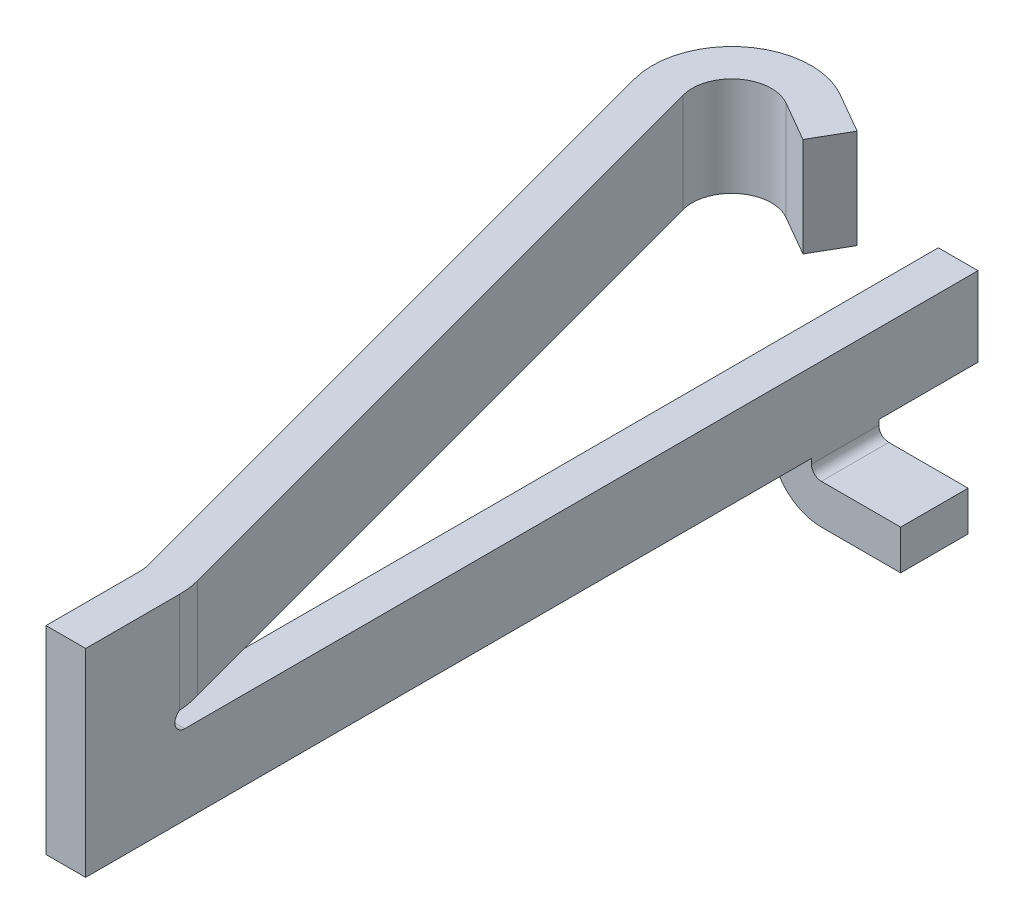
ISO-10303-21;
HEADER;
FILE_DESCRIPTION(('STEP AP214'),'2;1');
FILE_NAME('part.step','',(''),(''),'','','');
FILE_SCHEMA(('AUTOMOTIVE_DESIGN { 1 0 10303 214 1 1 1 1 }'));
ENDSEC;
DATA;
#1=APPLICATION_CONTEXT('core data for automotive mechanical design processes');
#2=APPLICATION_PROTOCOL_DEFINITION('international standard','automotive_design',2000,#1);
#3=PRODUCT_CONTEXT('',#1,'mechanical');
#4=PRODUCT('Part','Part','',(#3));
#5=PRODUCT_RELATED_PRODUCT_CATEGORY('part','',(#4));
#6=PRODUCT_DEFINITION_FORMATION('','',#4);
#7=PRODUCT_DEFINITION_CONTEXT('part definition',#1,'design');
#8=PRODUCT_DEFINITION('design','',#6,#7);
#9=PRODUCT_DEFINITION_SHAPE('','',#8);
#10=(LENGTH_UNIT() NAMED_UNIT(*) SI_UNIT(.MILLI.,.METRE.));
#11=(NAMED_UNIT(*) PLANE_ANGLE_UNIT() SI_UNIT($,.RADIAN.));
#12=(NAMED_UNIT(*) SI_UNIT($,.STERADIAN.) SOLID_ANGLE_UNIT());
#13=UNCERTAINTY_MEASURE_WITH_UNIT(LENGTH_MEASURE(1.E-05),#10,'distance_accuracy_value','');
#14=(GEOMETRIC_REPRESENTATION_CONTEXT(3) GLOBAL_UNCERTAINTY_ASSIGNED_CONTEXT((#13)) GLOBAL_UNIT_ASSIGNED_CONTEXT((#10,
#11,#12)) REPRESENTATION_CONTEXT('',''));
#15=CARTESIAN_POINT('',(0.,0.,0.));
#16=DIRECTION('',(0.,0.,1.));
#17=DIRECTION('',(1.,0.,0.));
#18=AXIS2_PLACEMENT_3D('',#15,#16,#17);
#19=CARTESIAN_POINT('',(4.18080024909605,1.21000000000001,-4.42279490687322));
#20=DIRECTION('',(0.866025403784432,0.,0.500000000000011));
#21=DIRECTION('',(0.,-1.,0.));
#22=AXIS2_PLACEMENT_3D('',#19,#20,#21);
#23=PLANE('',#22);
#24=DIRECTION('',(0.,-1.,0.));
#25=VECTOR('',#24,1.);
#26=CARTESIAN_POINT('',(4.28580024909606,0.950000000000007,-4.60466024166795));
#27=LINE('',#26,#25);
#28=CARTESIAN_POINT('',(4.28580024909605,1.20000000000001,-4.60466024166795));
#29=VERTEX_POINT('',#28);
#30=CARTESIAN_POINT('',(4.28580024909605,0.700000000000005,-4.60466024166794));
#31=VERTEX_POINT('',#30);
#32=EDGE_CURVE('E149',#29,#31,#27,.T.);
#33=ORIENTED_EDGE('',*,*,#32,.F.);
#34=DIRECTION('',(-0.500000000000009,0.,0.866025403784433));
#35=VECTOR('',#34,1.);
#36=CARTESIAN_POINT('',(4.23580024909605,1.20000000000001,-4.5180577012895));
#37=LINE('',#36,#35);
#38=CARTESIAN_POINT('',(4.18580024909605,1.20000000000001,-4.43145516091106));
#39=VERTEX_POINT('',#38);
#40=EDGE_CURVE('E141',#29,#39,#37,.T.);
#41=ORIENTED_EDGE('',*,*,#40,.T.);
#42=DIRECTION('',(0.,1.,0.));
#43=VECTOR('',#42,1.);
#44=CARTESIAN_POINT('',(4.18580024909605,0.950000000000008,-4.43145516091106));
#45=LINE('',#44,#43);
#46=CARTESIAN_POINT('',(4.18580024909605,0.700000000000005,-4.43145516091106));
#47=VERTEX_POINT('',#46);
#48=EDGE_CURVE('E133',#47,#39,#45,.T.);
#49=ORIENTED_EDGE('',*,*,#48,.F.);
#50=DIRECTION('',(-0.500000000000009,0.,0.866025403784433));
#51=VECTOR('',#50,1.);
#52=CARTESIAN_POINT('',(4.23580024909606,0.700000000000005,-4.5180577012895));
#53=LINE('',#52,#51);
#54=EDGE_CURVE('E151',#31,#47,#53,.T.);
#55=ORIENTED_EDGE('',*,*,#54,.F.);
#56=EDGE_LOOP('',(#33,#41,#49,#55));
#57=FACE_BOUND('',#56,.T.);
#58=ADVANCED_FACE('F17',(#57),#23,.T.);
#59=CARTESIAN_POINT('',(3.9742176205873,0.690000000000004,-4.55361244843644));
#60=DIRECTION('',(-0.5,0.,0.866025403784438));
#61=DIRECTION('',(0.866025403784438,0.,0.5));
#62=AXIS2_PLACEMENT_3D('',#59,#60,#61);
#63=PLANE('',#62);
#64=ORIENTED_EDGE('',*,*,#48,.T.);
#65=DIRECTION('',(-0.866025403784448,0.,-0.499999999999984));
#66=VECTOR('',#65,1.);
#67=CARTESIAN_POINT('',(4.08433906186059,1.20000000000001,-4.49003380467375));
#68=LINE('',#67,#66);
#69=CARTESIAN_POINT('',(3.98287787462513,1.20000000000001,-4.54861244843644));
#70=VERTEX_POINT('',#69);
#71=EDGE_CURVE('E124',#39,#70,#68,.T.);
#72=ORIENTED_EDGE('',*,*,#71,.T.);
#73=DIRECTION('',(0.,1.,0.));
#74=VECTOR('',#73,1.);
#75=CARTESIAN_POINT('',(3.98287787462514,0.950000000000007,-4.54861244843644));
#76=LINE('',#75,#74);
#77=CARTESIAN_POINT('',(3.98287787462513,0.700000000000005,-4.54861244843644));
#78=VERTEX_POINT('',#77);
#79=EDGE_CURVE('E476',#78,#70,#76,.T.);
#80=ORIENTED_EDGE('',*,*,#79,.F.);
#81=DIRECTION('',(-0.866025403784444,0.,-0.49999999999999));
#82=VECTOR('',#81,1.);
#83=CARTESIAN_POINT('',(4.08433906186059,0.700000000000005,-4.49003380467375));
#84=LINE('',#83,#82);
#85=EDGE_CURVE('E174',#47,#78,#84,.T.);
#86=ORIENTED_EDGE('',*,*,#85,.F.);
#87=EDGE_LOOP('',(#64,#72,#80,#86));
#88=FACE_BOUND('',#87,.T.);
#89=ADVANCED_FACE('F733',(#88),#63,.T.);
#90=CARTESIAN_POINT('',(4.2944605031339,0.690000000000005,-4.59966024166795));
#91=DIRECTION('',(0.500000000000005,0.,-0.866025403784435));
#92=DIRECTION('',(-0.866025403784435,0.,-0.500000000000005));
#93=AXIS2_PLACEMENT_3D('',#90,#91,#92);
#94=PLANE('',#93);
#95=ORIENTED_EDGE('',*,*,#32,.T.);
#96=DIRECTION('',(0.866025403784419,0.,0.500000000000034));
#97=VECTOR('',#96,1.);
#98=CARTESIAN_POINT('',(4.1843390618606,0.700000000000005,-4.66323888543063));
#99=LINE('',#98,#97);
#100=CARTESIAN_POINT('',(4.08287787462514,0.700000000000004,-4.72181752919333));
#101=VERTEX_POINT('',#100);
#102=EDGE_CURVE('E154',#101,#31,#99,.T.);
#103=ORIENTED_EDGE('',*,*,#102,.F.);
#104=DIRECTION('',(0.,-1.,0.));
#105=VECTOR('',#104,1.);
#106=CARTESIAN_POINT('',(4.08287787462514,0.950000000000007,-4.72181752919333));
#107=LINE('',#106,#105);
#108=CARTESIAN_POINT('',(4.08287787462514,1.2,-4.72181752919333));
#109=VERTEX_POINT('',#108);
#110=EDGE_CURVE('E158',#109,#101,#107,.T.);
#111=ORIENTED_EDGE('',*,*,#110,.F.);
#112=DIRECTION('',(0.866025403784435,0.,0.500000000000005));
#113=VECTOR('',#112,1.);
#114=CARTESIAN_POINT('',(4.1843390618606,1.2,-4.66323888543064));
#115=LINE('',#114,#113);
#116=EDGE_CURVE('E146',#109,#29,#115,.T.);
#117=ORIENTED_EDGE('',*,*,#116,.T.);
#118=EDGE_LOOP('',(#95,#103,#111,#117));
#119=FACE_BOUND('',#118,.T.);
#120=ADVANCED_FACE('F156',(#119),#94,.T.);
#121=CARTESIAN_POINT('',(3.88287787462514,1.20000000000001,-4.37540736767956));
#122=DIRECTION('',(0.,-1.,0.));
#123=DIRECTION('',(1.,0.,0.));
#124=AXIS2_PLACEMENT_3D('',#121,#122,#123);
#125=CYLINDRICAL_SURFACE('',#124,0.199999999999991);
#126=DIRECTION('',(0.,1.,0.));
#127=VECTOR('',#126,1.);
#128=CARTESIAN_POINT('',(3.68969270936733,0.95,-4.32364355865905));
#129=LINE('',#128,#127);
#130=CARTESIAN_POINT('',(3.68969270936732,0.700000000000004,-4.32364355865905));
#131=VERTEX_POINT('',#130);
#132=CARTESIAN_POINT('',(3.68969270936733,1.2,-4.32364355865905));
#133=VERTEX_POINT('',#132);
#134=EDGE_CURVE('E466',#131,#133,#129,.T.);
#135=ORIENTED_EDGE('',*,*,#134,.F.);
#136=CARTESIAN_POINT('',(3.88287787462513,0.700000000000005,-4.37540736767956));
#137=DIRECTION('',(0.,-1.,0.));
#138=DIRECTION('',(1.,0.,0.));
#139=AXIS2_PLACEMENT_3D('',#136,#137,#138);
#140=CIRCLE('',#139,0.199999999999991);
#141=EDGE_CURVE('E486',#78,#131,#140,.F.);
#142=ORIENTED_EDGE('',*,*,#141,.F.);
#143=ORIENTED_EDGE('',*,*,#79,.T.);
#144=CARTESIAN_POINT('',(3.88287787462514,1.20000000000001,-4.37540736767956));
#145=DIRECTION('',(0.,-1.,0.));
#146=DIRECTION('',(1.,0.,0.));
#147=AXIS2_PLACEMENT_3D('',#144,#145,#146);
#148=CIRCLE('',#147,0.199999999999991);
#149=EDGE_CURVE('E21',#70,#133,#148,.F.);
#150=ORIENTED_EDGE('',*,*,#149,.T.);
#151=EDGE_LOOP('',(#135,#142,#143,#150));
#152=FACE_BOUND('',#151,.T.);
#153=ADVANCED_FACE('F489',(#152),#125,.F.);
#154=CARTESIAN_POINT('',(3.88287787462513,0.700000000000006,-4.37540736767956));
#155=DIRECTION('',(0.,1.,0.));
#156=DIRECTION('',(0.,0.,1.));
#157=AXIS2_PLACEMENT_3D('',#154,#155,#156);
#158=CYLINDRICAL_SURFACE('',#157,0.399999999999996);
#159=DIRECTION('',(0.,-1.,0.));
#160=VECTOR('',#159,1.);
#161=CARTESIAN_POINT('',(3.4965075441095,0.95,-4.27187974963855));
#162=LINE('',#161,#160);
#163=CARTESIAN_POINT('',(3.49650754410951,1.20000000000001,-4.27187974963855));
#164=VERTEX_POINT('',#163);
#165=CARTESIAN_POINT('',(3.49650754410951,0.700000000000004,-4.27187974963855));
#166=VERTEX_POINT('',#165);
#167=EDGE_CURVE('E460',#164,#166,#162,.T.);
#168=ORIENTED_EDGE('',*,*,#167,.F.);
#169=CARTESIAN_POINT('',(3.88287787462513,1.20000000000001,-4.37540736767956));
#170=DIRECTION('',(0.,1.,0.));
#171=DIRECTION('',(0.,0.,1.));
#172=AXIS2_PLACEMENT_3D('',#169,#170,#171);
#173=CIRCLE('',#172,0.399999999999996);
#174=EDGE_CURVE('E475',#164,#109,#173,.F.);
#175=ORIENTED_EDGE('',*,*,#174,.T.);
#176=ORIENTED_EDGE('',*,*,#110,.T.);
#177=CARTESIAN_POINT('',(3.88287787462513,0.700000000000005,-4.37540736767956));
#178=DIRECTION('',(0.,1.,0.));
#179=DIRECTION('',(0.,0.,1.));
#180=AXIS2_PLACEMENT_3D('',#177,#178,#179);
#181=CIRCLE('',#180,0.399999999999996);
#182=EDGE_CURVE('E469',#166,#101,#181,.F.);
#183=ORIENTED_EDGE('',*,*,#182,.F.);
#184=EDGE_LOOP('',(#168,#175,#176,#183));
#185=FACE_BOUND('',#184,.T.);
#186=ADVANCED_FACE('F568',(#185),#158,.T.);
#187=CARTESIAN_POINT('',(4.58895852096666,0.69,-0.967537860260638));
#188=DIRECTION('',(0.965925826289069,0.,-0.258819045102518));
#189=DIRECTION('',(-0.258819045102518,0.,-0.965925826289069));
#190=AXIS2_PLACEMENT_3D('',#187,#188,#189);
#191=PLANE('',#190);
#192=DIRECTION('',(0.,-1.,0.));
#193=VECTOR('',#192,1.);
#194=CARTESIAN_POINT('',(4.58637033051563,0.95,-0.97719711852353));
#195=LINE('',#194,#193);
#196=CARTESIAN_POINT('',(4.58637033051563,1.2,-0.977197118523544));
#197=VERTEX_POINT('',#196);
#198=CARTESIAN_POINT('',(4.58637033051563,0.7,-0.977197118523543));
#199=VERTEX_POINT('',#198);
#200=EDGE_CURVE('E463',#197,#199,#195,.T.);
#201=ORIENTED_EDGE('',*,*,#200,.T.);
#202=DIRECTION('',(0.258819045102518,0.,0.965925826289069));
#203=VECTOR('',#202,1.);
#204=CARTESIAN_POINT('',(4.13803151994147,0.700000000000002,-2.65042033859129));
#205=LINE('',#204,#203);
#206=EDGE_CURVE('E453',#131,#199,#205,.T.);
#207=ORIENTED_EDGE('',*,*,#206,.F.);
#208=ORIENTED_EDGE('',*,*,#134,.T.);
#209=DIRECTION('',(0.258819045102518,0.,0.965925826289069));
#210=VECTOR('',#209,1.);
#211=CARTESIAN_POINT('',(4.13803151994148,1.2,-2.65042033859129));
#212=LINE('',#211,#210);
#213=EDGE_CURVE('E465',#133,#197,#212,.T.);
#214=ORIENTED_EDGE('',*,*,#213,.T.);
#215=EDGE_LOOP('',(#201,#207,#208,#214));
#216=FACE_BOUND('',#215,.T.);
#217=ADVANCED_FACE('F563',(#216),#191,.T.);
#218=CARTESIAN_POINT('',(3.49391935365848,0.69,-4.28153900790144));
#219=DIRECTION('',(-0.965925826289069,0.,0.258819045102518));
#220=DIRECTION('',(0.258819045102518,0.,0.965925826289069));
#221=AXIS2_PLACEMENT_3D('',#218,#219,#220);
#222=PLANE('',#221);
#223=DIRECTION('',(0.,1.,0.));
#224=VECTOR('',#223,1.);
#225=CARTESIAN_POINT('',(4.39318516525782,0.95,-0.925433309503025));
#226=LINE('',#225,#224);
#227=CARTESIAN_POINT('',(4.39318516525782,0.7,-0.925433309503009));
#228=VERTEX_POINT('',#227);
#229=CARTESIAN_POINT('',(4.39318516525782,1.2,-0.925433309503009));
#230=VERTEX_POINT('',#229);
#231=EDGE_CURVE('E457',#228,#230,#226,.T.);
#232=ORIENTED_EDGE('',*,*,#231,.T.);
#233=DIRECTION('',(-0.258819045102518,0.,-0.965925826289069));
#234=VECTOR('',#233,1.);
#235=CARTESIAN_POINT('',(3.94484635468366,1.2,-2.59865652957079));
#236=LINE('',#235,#234);
#237=EDGE_CURVE('E456',#230,#164,#236,.T.);
#238=ORIENTED_EDGE('',*,*,#237,.T.);
#239=ORIENTED_EDGE('',*,*,#167,.T.);
#240=DIRECTION('',(-0.258819045102518,0.,-0.965925826289069));
#241=VECTOR('',#240,1.);
#242=CARTESIAN_POINT('',(3.94484635468367,0.700000000000002,-2.59865652957079));
#243=LINE('',#242,#241);
#244=EDGE_CURVE('E450',#228,#166,#243,.T.);
#245=ORIENTED_EDGE('',*,*,#244,.F.);
#246=EDGE_LOOP('',(#232,#238,#239,#245));
#247=FACE_BOUND('',#246,.T.);
#248=ADVANCED_FACE('F565',(#247),#222,.T.);
#249=CARTESIAN_POINT('',(4.38611409744595,0.7,-0.913185860789109));
#250=DIRECTION('',(0.,-1.,0.));
#251=DIRECTION('',(-0.258819045102518,0.,-0.965925826289069));
#252=AXIS2_PLACEMENT_3D('',#249,#250,#251);
#253=PLANE('',#252);
#254=DIRECTION('',(0.965925826289068,0.,-0.258819045102523));
#255=VECTOR('',#254,1.);
#256=CARTESIAN_POINT('',(4.48977774788672,0.700000000000001,-0.951315214013278));
#257=LINE('',#256,#255);
#258=EDGE_CURVE('E187',#228,#199,#257,.T.);
#259=ORIENTED_EDGE('',*,*,#258,.F.);
#260=ORIENTED_EDGE('',*,*,#244,.T.);
#261=ORIENTED_EDGE('',*,*,#182,.T.);
#262=ORIENTED_EDGE('',*,*,#102,.T.);
#263=ORIENTED_EDGE('',*,*,#54,.T.);
#264=ORIENTED_EDGE('',*,*,#85,.T.);
#265=ORIENTED_EDGE('',*,*,#141,.T.);
#266=ORIENTED_EDGE('',*,*,#206,.T.);
#267=EDGE_LOOP('',(#259,#260,#261,#262,#263,#264,#265,#266));
#268=FACE_BOUND('',#267,.T.);
#269=ADVANCED_FACE('F202',(#268),#253,.T.);
#270=CARTESIAN_POINT('',(4.19999999999987,1.2,-0.873669500482516));
#271=DIRECTION('',(0.,-1.,0.));
#272=DIRECTION('',(0.,0.,-1.));
#273=AXIS2_PLACEMENT_3D('',#270,#271,#272);
#274=CYLINDRICAL_SURFACE('',#273,0.400000000000132);
#275=DIRECTION('',(0.,1.,0.));
#276=VECTOR('',#275,1.);
#277=CARTESIAN_POINT('',(4.6,0.687500000000014,-0.873669500482522));
#278=LINE('',#277,#276);
#279=CARTESIAN_POINT('',(4.6,0.692505350194535,-0.873669500482522));
#280=VERTEX_POINT('',#279);
#281=CARTESIAN_POINT('',(4.6,1.2,-0.873669500482519));
#282=VERTEX_POINT('',#281);
#283=EDGE_CURVE('E409',#280,#282,#278,.T.);
#284=ORIENTED_EDGE('',*,*,#283,.F.);
#285=CARTESIAN_POINT('',(4.6,0.692505350194535,-0.873669500482521));
#286=CARTESIAN_POINT('',(4.60000002743207,0.692817627269763,-0.878032824480609));
#287=CARTESIAN_POINT('',(4.59992860626844,0.693129904344991,-0.882396146926367));
#288=CARTESIAN_POINT('',(4.59964306371265,0.693754458495446,-0.891118120296096));
#289=CARTESIAN_POINT('',(4.59942894232047,0.694066735570674,-0.895476771220066));
#290=CARTESIAN_POINT('',(4.59885819627041,0.694691289721129,-0.904184733129091));
#291=CARTESIAN_POINT('',(4.59850157161252,0.695003566796357,-0.908534044114146));
#292=CARTESIAN_POINT('',(4.59764620972524,0.695628120946813,-0.917218669114545));
#293=CARTESIAN_POINT('',(4.59714747249586,0.69594039802204,-0.92155398312989));
#294=CARTESIAN_POINT('',(4.59600841660319,0.696564952172496,-0.930205971611195));
#295=CARTESIAN_POINT('',(4.59536809793992,0.696877229247724,-0.934522646077156));
#296=CARTESIAN_POINT('',(4.59394656772799,0.697501783398179,-0.943132733603559));
#297=CARTESIAN_POINT('',(4.59316535617933,0.697814060473407,-0.947426146664002));
#298=CARTESIAN_POINT('',(4.59146286814326,0.698438614623862,-0.955985111913945));
#299=CARTESIAN_POINT('',(4.59054159165584,0.69875089169909,-0.960250664103445));
#300=CARTESIAN_POINT('',(4.58855999176603,0.699375445849546,-0.968749347289098));
#301=CARTESIAN_POINT('',(4.58749966836363,0.699687722924773,-0.972982478285252));
#302=CARTESIAN_POINT('',(4.58637033051563,0.700000000000001,-0.977197118523531));
#303=B_SPLINE_CURVE_WITH_KNOTS('',3,(#285,#286,#287,#288,#289,#290,#291,#292,#293,#294,#295,
#296,#297,#298,#299,#300,#301,#302),.UNSPECIFIED.,.F.,.F.,(4,2,2,2,2,2,2,2,4),(0.,
0.0131228678385637,0.0262457356771275,0.0393686035156913,0.0524914713542551,0.0656143391928189,
0.0787372070313827,0.0918600748699465,0.10498294270851),.UNSPECIFIED.);
#304=EDGE_CURVE('E181',#199,#280,#303,.F.);
#305=ORIENTED_EDGE('',*,*,#304,.F.);
#306=ORIENTED_EDGE('',*,*,#200,.F.);
#307=CARTESIAN_POINT('',(4.19999999999987,1.2,-0.873669500482516));
#308=DIRECTION('',(0.,-1.,0.));
#309=DIRECTION('',(0.,0.,-1.));
#310=AXIS2_PLACEMENT_3D('',#307,#308,#309);
#311=CIRCLE('',#310,0.400000000000132);
#312=EDGE_CURVE('E426',#282,#197,#311,.F.);
#313=ORIENTED_EDGE('',*,*,#312,.F.);
#314=EDGE_LOOP('',(#284,#305,#306,#313));
#315=FACE_BOUND('',#314,.T.);
#316=ADVANCED_FACE('F191',(#315),#274,.T.);
#317=CARTESIAN_POINT('',(4.4,0.692505350194535,-0.873669500482521));
#318=CARTESIAN_POINT('',(4.46666666666667,0.692505350194535,-0.873669500482521));
#319=CARTESIAN_POINT('',(4.53333333333333,0.692505350194535,-0.873669500482521));
#320=CARTESIAN_POINT('',(4.6,0.692505350194535,-0.873669500482521));
#321=CARTESIAN_POINT('',(4.4,0.695003566796357,-0.891122793002464));
#322=CARTESIAN_POINT('',(4.46666759340885,0.695003566796357,-0.896940659755358));
#323=CARTESIAN_POINT('',(4.53333240659115,0.695003566796357,-0.902758218769514));
#324=CARTESIAN_POINT('',(4.6,0.695003566796357,-0.908576085522408));
#325=CARTESIAN_POINT('',(4.39770240976172,0.697501783398179,-0.908574723504234));
#326=CARTESIAN_POINT('',(4.46360413472939,0.697501783398179,-0.920209938619068));
#327=CARTESIAN_POINT('',(4.52950309455577,0.697501783398179,-0.931844731411114));
#328=CARTESIAN_POINT('',(4.59540481952344,0.697501783398179,-0.943479946525949));
#329=CARTESIAN_POINT('',(4.39318516525781,0.7,-0.925433309503025));
#330=CARTESIAN_POINT('',(4.45758022034375,0.700000000000001,-0.94268791250986));
#331=CARTESIAN_POINT('',(4.52197527542969,0.700000000000001,-0.959942515516695));
#332=CARTESIAN_POINT('',(4.58637033051563,0.700000000000001,-0.977197118523531));
#333=B_SPLINE_SURFACE_WITH_KNOTS('',3,3,((#317,#318,#319,#320),(#321,#322,#323,#324),(#325,#326,
#327,#328),(#329,#330,#331,#332)),.UNSPECIFIED.,.F.,.F.,.F.,(4,4),(4,4),(0.,
0.00684791992554108),(0.,0.02),.UNSPECIFIED.);
#334=DIRECTION('',(1.,0.,0.));
#335=VECTOR('',#334,1.);
#336=CARTESIAN_POINT('',(4.5,0.692505350194535,-0.873669500482522));
#337=LINE('',#336,#335);
#338=CARTESIAN_POINT('',(4.4,0.692505350194535,-0.873669500482522));
#339=VERTEX_POINT('',#338);
#340=EDGE_CURVE('E350',#339,#280,#337,.T.);
#341=CARTESIAN_POINT('',(4.39318516525781,0.7,-0.925433309503026));
#342=CARTESIAN_POINT('',(4.39374983418181,0.699687722924772,-0.923325989383887));
#343=CARTESIAN_POINT('',(4.39427999588301,0.699375445849545,-0.92120942388581));
#344=CARTESIAN_POINT('',(4.39527079582792,0.698750891699089,-0.916960082292983));
#345=CARTESIAN_POINT('',(4.39573143407163,0.698438614623862,-0.914827306198233));
#346=CARTESIAN_POINT('',(4.39658267808966,0.697814060473406,-0.910547823573262));
#347=CARTESIAN_POINT('',(4.39697328386399,0.697501783398178,-0.908401117043041));
#348=CARTESIAN_POINT('',(4.39768404896996,0.696877229247723,-0.904096073279839));
#349=CARTESIAN_POINT('',(4.39800420830159,0.696564952172495,-0.901937736046859));
#350=CARTESIAN_POINT('',(4.39857373624793,0.69594039802204,-0.897611741806206));
#351=CARTESIAN_POINT('',(4.39882310486262,0.695628120946812,-0.895444084798534));
#352=CARTESIAN_POINT('',(4.39925078580626,0.695003566796357,-0.891101772298335));
#353=CARTESIAN_POINT('',(4.3994290981352,0.694691289721129,-0.888927116805807));
#354=CARTESIAN_POINT('',(4.39971447116024,0.694066735570674,-0.884573135851295));
#355=CARTESIAN_POINT('',(4.39982153185632,0.693754458495446,-0.88239381038931));
#356=CARTESIAN_POINT('',(4.39996430313422,0.693129904344991,-0.878032823704445));
#357=CARTESIAN_POINT('',(4.40000001371603,0.692817627269763,-0.875851162481566));
#358=CARTESIAN_POINT('',(4.4,0.692505350194535,-0.873669500482522));
#359=B_SPLINE_CURVE_WITH_KNOTS('',3,(#341,#342,#343,#344,#345,#346,#347,#348,#349,#350,#351,
#352,#353,#354,#355,#356,#357,#358),.UNSPECIFIED.,.F.,.F.,(4,2,2,2,2,2,2,2,4),(0.,
0.00661140337872104,0.0132228067574422,0.0198342101361632,0.0264456135148841,0.0330570168936052,
0.0396684202723262,0.0462798236510472,0.0528912270297683),.UNSPECIFIED.);
#360=EDGE_CURVE('E188',#228,#339,#359,.T.);
#361=ORIENTED_EDGE('',*,*,#304,.T.);
#362=ORIENTED_EDGE('',*,*,#340,.F.);
#363=ORIENTED_EDGE('',*,*,#360,.F.);
#364=ORIENTED_EDGE('',*,*,#258,.T.);
#365=EDGE_LOOP('',(#361,#362,#363,#364));
#366=FACE_BOUND('',#365,.T.);
#367=ADVANCED_FACE('F201',(#366),#333,.T.);
#368=CARTESIAN_POINT('',(4.6,0.165000000000027,-0.39));
#369=DIRECTION('',(1.,0.,0.));
#370=DIRECTION('',(0.,0.,-1.));
#371=AXIS2_PLACEMENT_3D('',#368,#369,#370);
#372=PLANE('',#371);
#373=DIRECTION('',(0.,0.,1.));
#374=VECTOR('',#373,1.);
#375=CARTESIAN_POINT('',(4.6,0.199999999999922,-2.23));
#376=LINE('',#375,#374);
#377=CARTESIAN_POINT('',(4.6,0.2,-4.06));
#378=VERTEX_POINT('',#377);
#379=CARTESIAN_POINT('',(4.6,0.199999999999844,-0.4));
#380=VERTEX_POINT('',#379);
#381=EDGE_CURVE('E372',#378,#380,#376,.T.);
#382=ORIENTED_EDGE('',*,*,#381,.F.);
#383=DIRECTION('',(0.,1.,0.));
#384=VECTOR('',#383,1.);
#385=CARTESIAN_POINT('',(4.6,0.187500000000013,-4.06));
#386=LINE('',#385,#384);
#387=CARTESIAN_POINT('',(4.6,0.175000000000035,-4.06));
#388=VERTEX_POINT('',#387);
#389=EDGE_CURVE('E382',#388,#378,#386,.T.);
#390=ORIENTED_EDGE('',*,*,#389,.F.);
#391=DIRECTION('',(0.,0.,-1.));
#392=VECTOR('',#391,1.);
#393=CARTESIAN_POINT('',(4.6,0.175000000000027,-2.65));
#394=LINE('',#393,#392);
#395=CARTESIAN_POINT('',(4.6,0.175000000000035,-4.4));
#396=VERTEX_POINT('',#395);
#397=EDGE_CURVE('E186',#388,#396,#394,.T.);
#398=ORIENTED_EDGE('',*,*,#397,.T.);
#399=DIRECTION('',(0.,1.,0.));
#400=VECTOR('',#399,1.);
#401=CARTESIAN_POINT('',(4.6,0.687500000000014,-4.4));
#402=LINE('',#401,#400);
#403=CARTESIAN_POINT('',(4.6,0.200000000000026,-4.4));
#404=VERTEX_POINT('',#403);
#405=EDGE_CURVE('E441',#396,#404,#402,.T.);
#406=ORIENTED_EDGE('',*,*,#405,.T.);
#407=DIRECTION('',(0.,0.,-1.));
#408=VECTOR('',#407,1.);
#409=CARTESIAN_POINT('',(4.6,0.200000000000026,-2.65));
#410=LINE('',#409,#408);
#411=CARTESIAN_POINT('',(4.6,0.200000000000027,-4.9));
#412=VERTEX_POINT('',#411);
#413=EDGE_CURVE('E421',#404,#412,#410,.T.);
#414=ORIENTED_EDGE('',*,*,#413,.T.);
#415=DIRECTION('',(0.,1.,0.));
#416=VECTOR('',#415,1.);
#417=CARTESIAN_POINT('',(4.6,0.687500000000014,-4.9));
#418=LINE('',#417,#416);
#419=CARTESIAN_POINT('',(4.6,0.600000000000123,-4.9));
#420=VERTEX_POINT('',#419);
#421=EDGE_CURVE('E418',#412,#420,#418,.T.);
#422=ORIENTED_EDGE('',*,*,#421,.T.);
#423=DIRECTION('',(0.,0.,-1.));
#424=VECTOR('',#423,1.);
#425=CARTESIAN_POINT('',(4.6,0.600000000000062,-2.9));
#426=LINE('',#425,#424);
#427=CARTESIAN_POINT('',(4.6,0.6,-0.900000000000001));
#428=VERTEX_POINT('',#427);
#429=EDGE_CURVE('E343',#428,#420,#426,.T.);
#430=ORIENTED_EDGE('',*,*,#429,.F.);
#431=CARTESIAN_POINT('',(4.6,0.650000000000001,-0.9));
#432=DIRECTION('',(1.,0.,0.));
#433=DIRECTION('',(0.,0.,-1.));
#434=AXIS2_PLACEMENT_3D('',#431,#432,#433);
#435=CIRCLE('',#434,0.0499999999999992);
#436=EDGE_CURVE('E349',#280,#428,#435,.T.);
#437=ORIENTED_EDGE('',*,*,#436,.F.);
#438=ORIENTED_EDGE('',*,*,#283,.T.);
#439=DIRECTION('',(0.,0.,-1.));
#440=VECTOR('',#439,1.);
#441=CARTESIAN_POINT('',(4.6,1.2,-0.636834750241261));
#442=LINE('',#441,#440);
#443=CARTESIAN_POINT('',(4.6,1.2,-0.400000000000001));
#444=VERTEX_POINT('',#443);
#445=EDGE_CURVE('E361',#444,#282,#442,.T.);
#446=ORIENTED_EDGE('',*,*,#445,.F.);
#447=DIRECTION('',(0.,1.,0.));
#448=VECTOR('',#447,1.);
#449=CARTESIAN_POINT('',(4.6,0.699999999999922,-0.4));
#450=LINE('',#449,#448);
#451=EDGE_CURVE('E362',#380,#444,#450,.T.);
#452=ORIENTED_EDGE('',*,*,#451,.F.);
#453=EDGE_LOOP('',(#382,#390,#398,#406,#414,#422,#430,#437,#438,#446,#452));
#454=FACE_BOUND('',#453,.T.);
#455=ADVANCED_FACE('F205',(#454),#372,.T.);
#456=CARTESIAN_POINT('',(5.06,0.125000000000042,-4.05));
#457=DIRECTION('',(0.,1.,0.));
#458=DIRECTION('',(0.,0.,-1.));
#459=AXIS2_PLACEMENT_3D('',#456,#457,#458);
#460=PLANE('',#459);
#461=DIRECTION('',(0.,0.,1.));
#462=VECTOR('',#461,1.);
#463=CARTESIAN_POINT('',(5.05,0.125000000000042,-4.23));
#464=LINE('',#463,#462);
#465=CARTESIAN_POINT('',(5.05,0.125000000000044,-4.4));
#466=VERTEX_POINT('',#465);
#467=CARTESIAN_POINT('',(5.05,0.12500000000004,-4.06));
#468=VERTEX_POINT('',#467);
#469=EDGE_CURVE('E397',#466,#468,#464,.T.);
#470=ORIENTED_EDGE('',*,*,#469,.F.);
#471=DIRECTION('',(1.,0.,0.));
#472=VECTOR('',#471,1.);
#473=CARTESIAN_POINT('',(4.85,0.125000000000044,-4.4));
#474=LINE('',#473,#472);
#475=CARTESIAN_POINT('',(4.65,0.125000000000043,-4.4));
#476=VERTEX_POINT('',#475);
#477=EDGE_CURVE('E319',#476,#466,#474,.T.);
#478=ORIENTED_EDGE('',*,*,#477,.F.);
#479=DIRECTION('',(0.,0.,-1.));
#480=VECTOR('',#479,1.);
#481=CARTESIAN_POINT('',(4.65,0.125000000000042,-4.23));
#482=LINE('',#481,#480);
#483=CARTESIAN_POINT('',(4.65,0.125000000000042,-4.06));
#484=VERTEX_POINT('',#483);
#485=EDGE_CURVE('E309',#484,#476,#482,.T.);
#486=ORIENTED_EDGE('',*,*,#485,.F.);
#487=DIRECTION('',(-1.,0.,0.));
#488=VECTOR('',#487,1.);
#489=CARTESIAN_POINT('',(4.85,0.12500000000004,-4.06));
#490=LINE('',#489,#488);
#491=EDGE_CURVE('E387',#468,#484,#490,.T.);
#492=ORIENTED_EDGE('',*,*,#491,.F.);
#493=EDGE_LOOP('',(#470,#478,#486,#492));
#494=FACE_BOUND('',#493,.T.);
#495=ADVANCED_FACE('F208',(#494),#460,.T.);
#496=CARTESIAN_POINT('',(5.05,0.135000000000043,-4.41));
#497=DIRECTION('',(1.,0.,0.));
#498=DIRECTION('',(0.,0.,1.));
#499=AXIS2_PLACEMENT_3D('',#496,#497,#498);
#500=PLANE('',#499);
#501=DIRECTION('',(0.,0.,1.));
#502=VECTOR('',#501,1.);
#503=CARTESIAN_POINT('',(5.05,-0.074999999999959,-4.23));
#504=LINE('',#503,#502);
#505=CARTESIAN_POINT('',(5.05,-0.0749999999999573,-4.4));
#506=VERTEX_POINT('',#505);
#507=CARTESIAN_POINT('',(5.05,-0.0749999999999596,-4.06));
#508=VERTEX_POINT('',#507);
#509=EDGE_CURVE('E308',#506,#508,#504,.T.);
#510=ORIENTED_EDGE('',*,*,#509,.F.);
#511=DIRECTION('',(0.,-1.,0.));
#512=VECTOR('',#511,1.);
#513=CARTESIAN_POINT('',(5.05,0.0250000000000441,-4.4));
#514=LINE('',#513,#512);
#515=EDGE_CURVE('E322',#466,#506,#514,.T.);
#516=ORIENTED_EDGE('',*,*,#515,.F.);
#517=ORIENTED_EDGE('',*,*,#469,.T.);
#518=DIRECTION('',(0.,1.,0.));
#519=VECTOR('',#518,1.);
#520=CARTESIAN_POINT('',(5.05,0.0250000000000407,-4.06));
#521=LINE('',#520,#519);
#522=EDGE_CURVE('E392',#508,#468,#521,.T.);
#523=ORIENTED_EDGE('',*,*,#522,.F.);
#524=EDGE_LOOP('',(#510,#516,#517,#523));
#525=FACE_BOUND('',#524,.T.);
#526=ADVANCED_FACE('F212',(#525),#500,.T.);
#527=CARTESIAN_POINT('',(4.39,0.199999999999844,-0.39));
#528=DIRECTION('',(0.,-1.,0.));
#529=DIRECTION('',(0.,0.,-1.));
#530=AXIS2_PLACEMENT_3D('',#527,#528,#529);
#531=PLANE('',#530);
#532=ORIENTED_EDGE('',*,*,#381,.T.);
#533=DIRECTION('',(1.,0.,0.));
#534=VECTOR('',#533,1.);
#535=CARTESIAN_POINT('',(4.5,0.199999999999844,-0.4));
#536=LINE('',#535,#534);
#537=CARTESIAN_POINT('',(4.4,0.199999999999948,-0.4));
#538=VERTEX_POINT('',#537);
#539=EDGE_CURVE('E369',#538,#380,#536,.T.);
#540=ORIENTED_EDGE('',*,*,#539,.F.);
#541=DIRECTION('',(0.,0.,1.));
#542=VECTOR('',#541,1.);
#543=CARTESIAN_POINT('',(4.4,0.2,-2.65));
#544=LINE('',#543,#542);
#545=CARTESIAN_POINT('',(4.4,0.2,-4.06));
#546=VERTEX_POINT('',#545);
#547=EDGE_CURVE('E303',#546,#538,#544,.T.);
#548=ORIENTED_EDGE('',*,*,#547,.F.);
#549=DIRECTION('',(1.,0.,0.));
#550=VECTOR('',#549,1.);
#551=CARTESIAN_POINT('',(4.5,0.2,-4.06));
#552=LINE('',#551,#550);
#553=EDGE_CURVE('E379',#546,#378,#552,.T.);
#554=ORIENTED_EDGE('',*,*,#553,.T.);
#555=EDGE_LOOP('',(#532,#540,#548,#554));
#556=FACE_BOUND('',#555,.T.);
#557=ADVANCED_FACE('F216',(#556),#531,.T.);
#558=CARTESIAN_POINT('',(4.39,1.21,-0.4));
#559=DIRECTION('',(0.,0.,1.));
#560=DIRECTION('',(0.,-1.,0.));
#561=AXIS2_PLACEMENT_3D('',#558,#559,#560);
#562=PLANE('',#561);
#563=ORIENTED_EDGE('',*,*,#451,.T.);
#564=DIRECTION('',(1.,0.,0.));
#565=VECTOR('',#564,1.);
#566=CARTESIAN_POINT('',(4.5,1.2,-0.4));
#567=LINE('',#566,#565);
#568=CARTESIAN_POINT('',(4.4,1.2,-0.4));
#569=VERTEX_POINT('',#568);
#570=EDGE_CURVE('E359',#569,#444,#567,.T.);
#571=ORIENTED_EDGE('',*,*,#570,.F.);
#572=DIRECTION('',(0.,1.,0.));
#573=VECTOR('',#572,1.);
#574=CARTESIAN_POINT('',(4.4,0.687500000000014,-0.4));
#575=LINE('',#574,#573);
#576=EDGE_CURVE('E356',#538,#569,#575,.T.);
#577=ORIENTED_EDGE('',*,*,#576,.F.);
#578=ORIENTED_EDGE('',*,*,#539,.T.);
#579=EDGE_LOOP('',(#563,#571,#577,#578));
#580=FACE_BOUND('',#579,.T.);
#581=ADVANCED_FACE('F220',(#580),#562,.T.);
#582=CARTESIAN_POINT('',(4.39,1.2,-0.883669500482521));
#583=DIRECTION('',(0.,1.,0.));
#584=DIRECTION('',(0.,0.,1.));
#585=AXIS2_PLACEMENT_3D('',#582,#583,#584);
#586=PLANE('',#585);
#587=ORIENTED_EDGE('',*,*,#570,.T.);
#588=ORIENTED_EDGE('',*,*,#445,.T.);
#589=ORIENTED_EDGE('',*,*,#312,.T.);
#590=ORIENTED_EDGE('',*,*,#213,.F.);
#591=ORIENTED_EDGE('',*,*,#149,.F.);
#592=ORIENTED_EDGE('',*,*,#71,.F.);
#593=ORIENTED_EDGE('',*,*,#40,.F.);
#594=ORIENTED_EDGE('',*,*,#116,.F.);
#595=ORIENTED_EDGE('',*,*,#174,.F.);
#596=ORIENTED_EDGE('',*,*,#237,.F.);
#597=CARTESIAN_POINT('',(4.20000000000013,1.2,-0.873669500482522));
#598=DIRECTION('',(0.,1.,0.));
#599=DIRECTION('',(0.,0.,1.));
#600=AXIS2_PLACEMENT_3D('',#597,#598,#599);
#601=CIRCLE('',#600,0.199999999999868);
#602=CARTESIAN_POINT('',(4.4,1.2,-0.873669500482522));
#603=VERTEX_POINT('',#602);
#604=EDGE_CURVE('E353',#603,#230,#601,.T.);
#605=ORIENTED_EDGE('',*,*,#604,.F.);
#606=DIRECTION('',(0.,0.,-1.));
#607=VECTOR('',#606,1.);
#608=CARTESIAN_POINT('',(4.4,1.2,-2.65));
#609=LINE('',#608,#607);
#610=EDGE_CURVE('E296',#569,#603,#609,.T.);
#611=ORIENTED_EDGE('',*,*,#610,.F.);
#612=EDGE_LOOP('',(#587,#588,#589,#590,#591,#592,#593,#594,#595,#596,#605,#611));
#613=FACE_BOUND('',#612,.T.);
#614=ADVANCED_FACE('F144',(#613),#586,.T.);
#615=CARTESIAN_POINT('',(4.20000000000013,0.692505350194535,-0.873669500482522));
#616=DIRECTION('',(0.,1.,0.));
#617=DIRECTION('',(0.,0.,1.));
#618=AXIS2_PLACEMENT_3D('',#615,#616,#617);
#619=CYLINDRICAL_SURFACE('',#618,0.199999999999868);
#620=DIRECTION('',(0.,-1.,0.));
#621=VECTOR('',#620,1.);
#622=CARTESIAN_POINT('',(4.4,0.687500000000014,-0.873669500482522));
#623=LINE('',#622,#621);
#624=EDGE_CURVE('E293',#603,#339,#623,.T.);
#625=ORIENTED_EDGE('',*,*,#624,.F.);
#626=ORIENTED_EDGE('',*,*,#604,.T.);
#627=ORIENTED_EDGE('',*,*,#231,.F.);
#628=ORIENTED_EDGE('',*,*,#360,.T.);
#629=EDGE_LOOP('',(#625,#626,#627,#628));
#630=FACE_BOUND('',#629,.T.);
#631=ADVANCED_FACE('F226',(#630),#619,.F.);
#632=CARTESIAN_POINT('',(4.4,0.650000000000001,-0.9));
#633=DIRECTION('',(1.,0.,0.));
#634=DIRECTION('',(0.,0.,-1.));
#635=AXIS2_PLACEMENT_3D('',#632,#633,#634);
#636=CYLINDRICAL_SURFACE('',#635,0.0499999999999992);
#637=DIRECTION('',(1.,0.,0.));
#638=VECTOR('',#637,1.);
#639=CARTESIAN_POINT('',(4.5,0.6,-0.9));
#640=LINE('',#639,#638);
#641=CARTESIAN_POINT('',(4.4,0.6,-0.9));
#642=VERTEX_POINT('',#641);
#643=EDGE_CURVE('E346',#642,#428,#640,.T.);
#644=ORIENTED_EDGE('',*,*,#643,.F.);
#645=CARTESIAN_POINT('',(4.4,0.650000000000001,-0.9));
#646=DIRECTION('',(1.,0.,0.));
#647=DIRECTION('',(0.,0.,-1.));
#648=AXIS2_PLACEMENT_3D('',#645,#646,#647);
#649=CIRCLE('',#648,0.0499999999999992);
#650=EDGE_CURVE('E290',#339,#642,#649,.T.);
#651=ORIENTED_EDGE('',*,*,#650,.F.);
#652=ORIENTED_EDGE('',*,*,#340,.T.);
#653=ORIENTED_EDGE('',*,*,#436,.T.);
#654=EDGE_LOOP('',(#644,#651,#652,#653));
#655=FACE_BOUND('',#654,.T.);
#656=ADVANCED_FACE('F230',(#655),#636,.F.);
#657=CARTESIAN_POINT('',(4.39,0.600000000000123,-4.91));
#658=DIRECTION('',(0.,1.,0.));
#659=DIRECTION('',(0.,0.,1.));
#660=AXIS2_PLACEMENT_3D('',#657,#658,#659);
#661=PLANE('',#660);
#662=ORIENTED_EDGE('',*,*,#429,.T.);
#663=DIRECTION('',(1.,0.,0.));
#664=VECTOR('',#663,1.);
#665=CARTESIAN_POINT('',(4.5,0.600000000000123,-4.9));
#666=LINE('',#665,#664);
#667=CARTESIAN_POINT('',(4.4,0.600000000000041,-4.9));
#668=VERTEX_POINT('',#667);
#669=EDGE_CURVE('E334',#668,#420,#666,.T.);
#670=ORIENTED_EDGE('',*,*,#669,.F.);
#671=DIRECTION('',(0.,0.,-1.));
#672=VECTOR('',#671,1.);
#673=CARTESIAN_POINT('',(4.4,0.6,-2.65));
#674=LINE('',#673,#672);
#675=EDGE_CURVE('E286',#642,#668,#674,.T.);
#676=ORIENTED_EDGE('',*,*,#675,.F.);
#677=ORIENTED_EDGE('',*,*,#643,.T.);
#678=EDGE_LOOP('',(#662,#670,#676,#677));
#679=FACE_BOUND('',#678,.T.);
#680=ADVANCED_FACE('F234',(#679),#661,.T.);
#681=CARTESIAN_POINT('',(4.39,0.190000000000028,-4.9));
#682=DIRECTION('',(0.,0.,-1.));
#683=DIRECTION('',(0.,1.,0.));
#684=AXIS2_PLACEMENT_3D('',#681,#682,#683);
#685=PLANE('',#684);
#686=ORIENTED_EDGE('',*,*,#421,.F.);
#687=DIRECTION('',(1.,0.,0.));
#688=VECTOR('',#687,1.);
#689=CARTESIAN_POINT('',(4.5,0.200000000000028,-4.9));
#690=LINE('',#689,#688);
#691=CARTESIAN_POINT('',(4.4,0.200000000000028,-4.9));
#692=VERTEX_POINT('',#691);
#693=EDGE_CURVE('E323',#692,#412,#690,.T.);
#694=ORIENTED_EDGE('',*,*,#693,.F.);
#695=DIRECTION('',(0.,-1.,0.));
#696=VECTOR('',#695,1.);
#697=CARTESIAN_POINT('',(4.4,0.687500000000014,-4.9));
#698=LINE('',#697,#696);
#699=EDGE_CURVE('E289',#668,#692,#698,.T.);
#700=ORIENTED_EDGE('',*,*,#699,.F.);
#701=ORIENTED_EDGE('',*,*,#669,.T.);
#702=EDGE_LOOP('',(#686,#694,#700,#701));
#703=FACE_BOUND('',#702,.T.);
#704=ADVANCED_FACE('F238',(#703),#685,.T.);
#705=CARTESIAN_POINT('',(4.39,0.200000000000026,-4.39));
#706=DIRECTION('',(0.,-1.,0.));
#707=DIRECTION('',(0.,0.,-1.));
#708=AXIS2_PLACEMENT_3D('',#705,#706,#707);
#709=PLANE('',#708);
#710=ORIENTED_EDGE('',*,*,#413,.F.);
#711=DIRECTION('',(1.,0.,0.));
#712=VECTOR('',#711,1.);
#713=CARTESIAN_POINT('',(4.5,0.200000000000026,-4.4));
#714=LINE('',#713,#712);
#715=CARTESIAN_POINT('',(4.4,0.200000000000027,-4.4));
#716=VERTEX_POINT('',#715);
#717=EDGE_CURVE('E318',#716,#404,#714,.T.);
#718=ORIENTED_EDGE('',*,*,#717,.F.);
#719=DIRECTION('',(0.,0.,1.));
#720=VECTOR('',#719,1.);
#721=CARTESIAN_POINT('',(4.4,0.200000000000028,-2.65));
#722=LINE('',#721,#720);
#723=EDGE_CURVE('E298',#692,#716,#722,.T.);
#724=ORIENTED_EDGE('',*,*,#723,.F.);
#725=ORIENTED_EDGE('',*,*,#693,.T.);
#726=EDGE_LOOP('',(#710,#718,#724,#725));
#727=FACE_BOUND('',#726,.T.);
#728=ADVANCED_FACE('F242',(#727),#709,.T.);
#729=CARTESIAN_POINT('',(4.65,0.175000000000042,-4.4));
#730=DIRECTION('',(0.,0.,1.));
#731=DIRECTION('',(1.,0.,0.));
#732=AXIS2_PLACEMENT_3D('',#729,#730,#731);
#733=CYLINDRICAL_SURFACE('',#732,0.049999999999999);
#734=ORIENTED_EDGE('',*,*,#397,.F.);
#735=CARTESIAN_POINT('',(4.65,0.175000000000042,-4.06));
#736=DIRECTION('',(0.,0.,1.));
#737=DIRECTION('',(1.,0.,0.));
#738=AXIS2_PLACEMENT_3D('',#735,#736,#737);
#739=CIRCLE('',#738,0.049999999999999);
#740=EDGE_CURVE('E304',#484,#388,#739,.F.);
#741=ORIENTED_EDGE('',*,*,#740,.F.);
#742=ORIENTED_EDGE('',*,*,#485,.T.);
#743=CARTESIAN_POINT('',(4.65,0.175000000000042,-4.4));
#744=DIRECTION('',(0.,0.,1.));
#745=DIRECTION('',(1.,0.,0.));
#746=AXIS2_PLACEMENT_3D('',#743,#744,#745);
#747=CIRCLE('',#746,0.049999999999999);
#748=EDGE_CURVE('E285',#396,#476,#747,.T.);
#749=ORIENTED_EDGE('',*,*,#748,.F.);
#750=EDGE_LOOP('',(#734,#741,#742,#749));
#751=FACE_BOUND('',#750,.T.);
#752=ADVANCED_FACE('F246',(#751),#733,.F.);
#753=CARTESIAN_POINT('',(5.06,-0.0749999999999584,-4.41));
#754=DIRECTION('',(0.,-1.,0.));
#755=DIRECTION('',(0.,0.,1.));
#756=AXIS2_PLACEMENT_3D('',#753,#754,#755);
#757=PLANE('',#756);
#758=ORIENTED_EDGE('',*,*,#509,.T.);
#759=DIRECTION('',(-1.,0.,0.));
#760=VECTOR('',#759,1.);
#761=CARTESIAN_POINT('',(4.85,-0.0749999999999596,-4.06));
#762=LINE('',#761,#760);
#763=CARTESIAN_POINT('',(4.65,-0.0749999999999593,-4.06));
#764=VERTEX_POINT('',#763);
#765=EDGE_CURVE('E312',#508,#764,#762,.T.);
#766=ORIENTED_EDGE('',*,*,#765,.T.);
#767=DIRECTION('',(0.,0.,1.));
#768=VECTOR('',#767,1.);
#769=CARTESIAN_POINT('',(4.65,-0.0749999999999592,-4.23));
#770=LINE('',#769,#768);
#771=CARTESIAN_POINT('',(4.65,-0.0749999999999585,-4.4));
#772=VERTEX_POINT('',#771);
#773=EDGE_CURVE('E281',#772,#764,#770,.T.);
#774=ORIENTED_EDGE('',*,*,#773,.F.);
#775=DIRECTION('',(1.,0.,0.));
#776=VECTOR('',#775,1.);
#777=CARTESIAN_POINT('',(4.85,-0.0749999999999584,-4.4));
#778=LINE('',#777,#776);
#779=EDGE_CURVE('E273',#772,#506,#778,.T.);
#780=ORIENTED_EDGE('',*,*,#779,.T.);
#781=EDGE_LOOP('',(#758,#766,#774,#780));
#782=FACE_BOUND('',#781,.T.);
#783=ADVANCED_FACE('F250',(#782),#757,.T.);
#784=CARTESIAN_POINT('',(4.39,-0.0849999999999598,-4.06));
#785=DIRECTION('',(0.,0.,1.));
#786=DIRECTION('',(1.,0.,0.));
#787=AXIS2_PLACEMENT_3D('',#784,#785,#786);
#788=PLANE('',#787);
#789=ORIENTED_EDGE('',*,*,#740,.T.);
#790=ORIENTED_EDGE('',*,*,#389,.T.);
#791=ORIENTED_EDGE('',*,*,#553,.F.);
#792=DIRECTION('',(0.,1.,0.));
#793=VECTOR('',#792,1.);
#794=CARTESIAN_POINT('',(4.4,0.687500000000014,-4.06));
#795=LINE('',#794,#793);
#796=CARTESIAN_POINT('',(4.4,0.175000000000033,-4.06));
#797=VERTEX_POINT('',#796);
#798=EDGE_CURVE('E301',#797,#546,#795,.T.);
#799=ORIENTED_EDGE('',*,*,#798,.F.);
#800=CARTESIAN_POINT('',(4.65,0.17500000000004,-4.06));
#801=DIRECTION('',(0.,0.,-1.));
#802=DIRECTION('',(-1.,0.,0.));
#803=AXIS2_PLACEMENT_3D('',#800,#801,#802);
#804=CIRCLE('',#803,0.249999999999999);
#805=EDGE_CURVE('E278',#764,#797,#804,.T.);
#806=ORIENTED_EDGE('',*,*,#805,.F.);
#807=ORIENTED_EDGE('',*,*,#765,.F.);
#808=ORIENTED_EDGE('',*,*,#522,.T.);
#809=ORIENTED_EDGE('',*,*,#491,.T.);
#810=EDGE_LOOP('',(#789,#790,#791,#799,#806,#807,#808,#809));
#811=FACE_BOUND('',#810,.T.);
#812=ADVANCED_FACE('F254',(#811),#788,.T.);
#813=CARTESIAN_POINT('',(4.4,0.165000000000027,-4.91));
#814=DIRECTION('',(-1.,0.,0.));
#815=DIRECTION('',(0.,0.,1.));
#816=AXIS2_PLACEMENT_3D('',#813,#814,#815);
#817=PLANE('',#816);
#818=ORIENTED_EDGE('',*,*,#723,.T.);
#819=DIRECTION('',(0.,-1.,0.));
#820=VECTOR('',#819,1.);
#821=CARTESIAN_POINT('',(4.4,0.687500000000013,-4.4));
#822=LINE('',#821,#820);
#823=CARTESIAN_POINT('',(4.4,0.175000000000035,-4.4));
#824=VERTEX_POINT('',#823);
#825=EDGE_CURVE('E36',#716,#824,#822,.T.);
#826=ORIENTED_EDGE('',*,*,#825,.T.);
#827=DIRECTION('',(0.,0.,-1.));
#828=VECTOR('',#827,1.);
#829=CARTESIAN_POINT('',(4.4,0.175000000000041,-4.23));
#830=LINE('',#829,#828);
#831=EDGE_CURVE('E27',#797,#824,#830,.T.);
#832=ORIENTED_EDGE('',*,*,#831,.F.);
#833=ORIENTED_EDGE('',*,*,#798,.T.);
#834=ORIENTED_EDGE('',*,*,#547,.T.);
#835=ORIENTED_EDGE('',*,*,#576,.T.);
#836=ORIENTED_EDGE('',*,*,#610,.T.);
#837=ORIENTED_EDGE('',*,*,#624,.T.);
#838=ORIENTED_EDGE('',*,*,#650,.T.);
#839=ORIENTED_EDGE('',*,*,#675,.T.);
#840=ORIENTED_EDGE('',*,*,#699,.T.);
#841=EDGE_LOOP('',(#818,#826,#832,#833,#834,#835,#836,#837,#838,#839,#840));
#842=FACE_BOUND('',#841,.T.);
#843=ADVANCED_FACE('F258',(#842),#817,.T.);
#844=CARTESIAN_POINT('',(4.66,-0.0849999999999582,-4.4));
#845=DIRECTION('',(0.,0.,-1.));
#846=DIRECTION('',(-1.,0.,0.));
#847=AXIS2_PLACEMENT_3D('',#844,#845,#846);
#848=PLANE('',#847);
#849=CARTESIAN_POINT('',(4.65,0.17500000000004,-4.4));
#850=DIRECTION('',(0.,0.,-1.));
#851=DIRECTION('',(-1.,0.,0.));
#852=AXIS2_PLACEMENT_3D('',#849,#850,#851);
#853=CIRCLE('',#852,0.249999999999999);
#854=EDGE_CURVE('E11',#824,#772,#853,.F.);
#855=ORIENTED_EDGE('',*,*,#854,.F.);
#856=ORIENTED_EDGE('',*,*,#825,.F.);
#857=ORIENTED_EDGE('',*,*,#717,.T.);
#858=ORIENTED_EDGE('',*,*,#405,.F.);
#859=ORIENTED_EDGE('',*,*,#748,.T.);
#860=ORIENTED_EDGE('',*,*,#477,.T.);
#861=ORIENTED_EDGE('',*,*,#515,.T.);
#862=ORIENTED_EDGE('',*,*,#779,.F.);
#863=EDGE_LOOP('',(#855,#856,#857,#858,#859,#860,#861,#862));
#864=FACE_BOUND('',#863,.T.);
#865=ADVANCED_FACE('F261',(#864),#848,.T.);
#866=CARTESIAN_POINT('',(4.65,0.17500000000004,-4.06));
#867=DIRECTION('',(0.,0.,-1.));
#868=DIRECTION('',(-1.,0.,0.));
#869=AXIS2_PLACEMENT_3D('',#866,#867,#868);
#870=CYLINDRICAL_SURFACE('',#869,0.249999999999999);
#871=ORIENTED_EDGE('',*,*,#831,.T.);
#872=ORIENTED_EDGE('',*,*,#854,.T.);
#873=ORIENTED_EDGE('',*,*,#773,.T.);
#874=ORIENTED_EDGE('',*,*,#805,.T.);
#875=EDGE_LOOP('',(#871,#872,#873,#874));
#876=FACE_BOUND('',#875,.T.);
#877=ADVANCED_FACE('F19',(#876),#870,.T.);
#878=CLOSED_SHELL('',(#58,#89,#120,#153,#186,#217,#248,#269,#316,#367,#455,#495,#526,#557,#581,
#614,#631,#656,#680,#704,#728,#752,#783,#812,#843,#865,#877));
#879=MANIFOLD_SOLID_BREP('B1',#878);
#880=ADVANCED_BREP_SHAPE_REPRESENTATION('',(#18,#879),#14);
#881=SHAPE_DEFINITION_REPRESENTATION(#9,#880);
ENDSEC;
END-ISO-10303-21;
